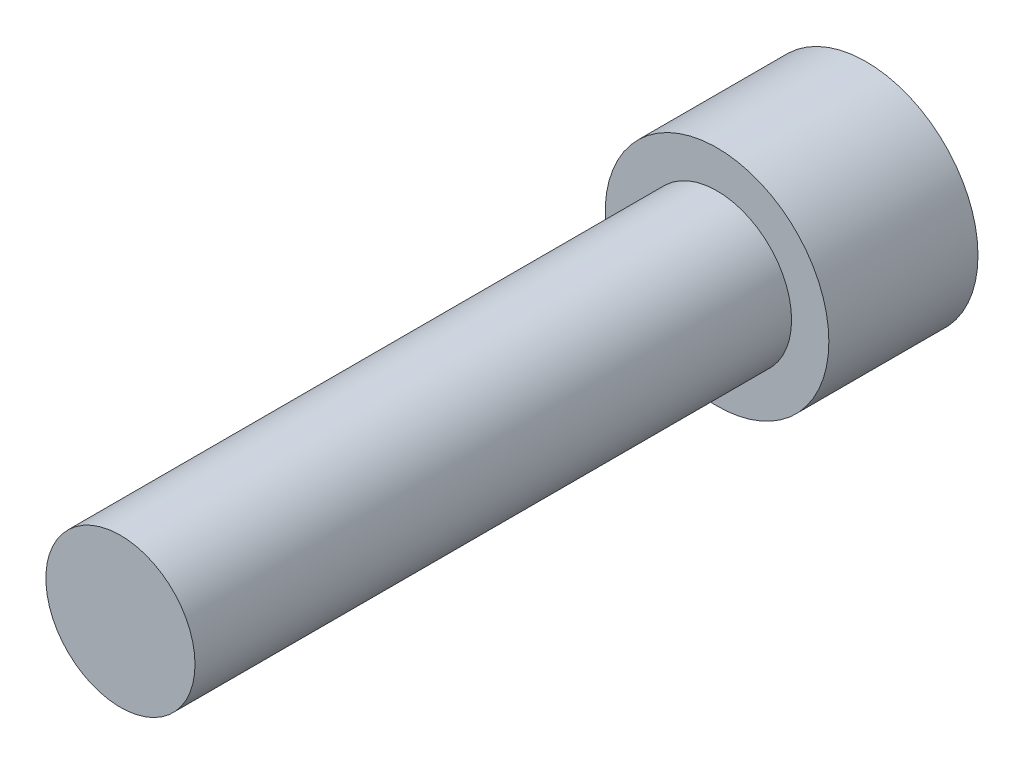
ISO-10303-21;
HEADER;
FILE_DESCRIPTION(('STEP AP214'),'2;1');
FILE_NAME('part.step','',(''),(''),'','','');
FILE_SCHEMA(('AUTOMOTIVE_DESIGN { 1 0 10303 214 1 1 1 1 }'));
ENDSEC;
DATA;
#1=APPLICATION_CONTEXT('core data for automotive mechanical design processes');
#2=APPLICATION_PROTOCOL_DEFINITION('international standard','automotive_design',2000,#1);
#3=PRODUCT_CONTEXT('',#1,'mechanical');
#4=PRODUCT('Part','Part','',(#3));
#5=PRODUCT_RELATED_PRODUCT_CATEGORY('part','',(#4));
#6=PRODUCT_DEFINITION_FORMATION('','',#4);
#7=PRODUCT_DEFINITION_CONTEXT('part definition',#1,'design');
#8=PRODUCT_DEFINITION('design','',#6,#7);
#9=PRODUCT_DEFINITION_SHAPE('','',#8);
#10=(LENGTH_UNIT() NAMED_UNIT(*) SI_UNIT(.MILLI.,.METRE.));
#11=(NAMED_UNIT(*) PLANE_ANGLE_UNIT() SI_UNIT($,.RADIAN.));
#12=(NAMED_UNIT(*) SI_UNIT($,.STERADIAN.) SOLID_ANGLE_UNIT());
#13=UNCERTAINTY_MEASURE_WITH_UNIT(LENGTH_MEASURE(1.E-05),#10,'distance_accuracy_value','');
#14=(GEOMETRIC_REPRESENTATION_CONTEXT(3) GLOBAL_UNCERTAINTY_ASSIGNED_CONTEXT((#13)) GLOBAL_UNIT_ASSIGNED_CONTEXT((#10,
#11,#12)) REPRESENTATION_CONTEXT('',''));
#15=CARTESIAN_POINT('',(0.,0.,0.));
#16=DIRECTION('',(0.,0.,1.));
#17=DIRECTION('',(1.,0.,0.));
#18=AXIS2_PLACEMENT_3D('',#15,#16,#17);
#19=CARTESIAN_POINT('',(0.,0.,10.));
#20=DIRECTION('',(0.,0.,-1.));
#21=DIRECTION('',(-1.,0.,0.));
#22=AXIS2_PLACEMENT_3D('',#19,#20,#21);
#23=CYLINDRICAL_SURFACE('',#22,7.5);
#24=CARTESIAN_POINT('',(0.,0.,10.));
#25=DIRECTION('',(0.,0.,1.));
#26=DIRECTION('',(1.,0.,0.));
#27=AXIS2_PLACEMENT_3D('',#24,#25,#26);
#28=CIRCLE('',#27,7.5);
#29=CARTESIAN_POINT('',(7.5,0.,10.));
#30=VERTEX_POINT('',#29);
#31=EDGE_CURVE('E54',#30,#30,#28,.T.);
#32=ORIENTED_EDGE('',*,*,#31,.F.);
#33=EDGE_LOOP('',(#32));
#34=FACE_BOUND('',#33,.T.);
#35=CARTESIAN_POINT('',(0.,0.,0.));
#36=DIRECTION('',(0.,0.,1.));
#37=DIRECTION('',(1.,0.,0.));
#38=AXIS2_PLACEMENT_3D('',#35,#36,#37);
#39=CIRCLE('',#38,7.5);
#40=CARTESIAN_POINT('',(7.5,0.,0.));
#41=VERTEX_POINT('',#40);
#42=EDGE_CURVE('E48',#41,#41,#39,.T.);
#43=ORIENTED_EDGE('',*,*,#42,.T.);
#44=EDGE_LOOP('',(#43));
#45=FACE_BOUND('',#44,.T.);
#46=ADVANCED_FACE('F45',(#34,#45),#23,.T.);
#47=CARTESIAN_POINT('',(0.,0.,10.));
#48=DIRECTION('',(0.,0.,1.));
#49=DIRECTION('',(1.,0.,0.));
#50=AXIS2_PLACEMENT_3D('',#47,#48,#49);
#51=PLANE('',#50);
#52=CARTESIAN_POINT('',(0.,0.,10.));
#53=DIRECTION('',(0.,0.,1.));
#54=DIRECTION('',(1.,0.,0.));
#55=AXIS2_PLACEMENT_3D('',#52,#53,#54);
#56=CIRCLE('',#55,5.);
#57=CARTESIAN_POINT('',(5.,0.,10.));
#58=VERTEX_POINT('',#57);
#59=EDGE_CURVE('E11',#58,#58,#56,.T.);
#60=ORIENTED_EDGE('',*,*,#59,.F.);
#61=EDGE_LOOP('',(#60));
#62=FACE_BOUND('',#61,.T.);
#63=ORIENTED_EDGE('',*,*,#31,.T.);
#64=EDGE_LOOP('',(#63));
#65=FACE_BOUND('',#64,.T.);
#66=ADVANCED_FACE('F185',(#62,#65),#51,.T.);
#67=CARTESIAN_POINT('',(0.,0.,0.));
#68=DIRECTION('',(0.,0.,1.));
#69=DIRECTION('',(1.,0.,0.));
#70=AXIS2_PLACEMENT_3D('',#67,#68,#69);
#71=PLANE('',#70);
#72=DIRECTION('',(1.,0.,0.));
#73=VECTOR('',#72,1.);
#74=CARTESIAN_POINT('',(-2.88675134594813,5.,0.));
#75=LINE('',#74,#73);
#76=CARTESIAN_POINT('',(-2.88675134594813,5.,0.));
#77=VERTEX_POINT('',#76);
#78=CARTESIAN_POINT('',(2.88675134594813,5.,0.));
#79=VERTEX_POINT('',#78);
#80=EDGE_CURVE('E142',#77,#79,#75,.T.);
#81=ORIENTED_EDGE('',*,*,#80,.F.);
#82=DIRECTION('',(0.5,0.866025403784439,0.));
#83=VECTOR('',#82,1.);
#84=CARTESIAN_POINT('',(-5.77350269189626,0.,0.));
#85=LINE('',#84,#83);
#86=CARTESIAN_POINT('',(-5.77350269189626,0.,0.));
#87=VERTEX_POINT('',#86);
#88=EDGE_CURVE('E62',#87,#77,#85,.T.);
#89=ORIENTED_EDGE('',*,*,#88,.F.);
#90=DIRECTION('',(-0.5,0.866025403784439,0.));
#91=VECTOR('',#90,1.);
#92=CARTESIAN_POINT('',(-2.88675134594813,-5.,0.));
#93=LINE('',#92,#91);
#94=CARTESIAN_POINT('',(-2.88675134594813,-5.,0.));
#95=VERTEX_POINT('',#94);
#96=EDGE_CURVE('E155',#95,#87,#93,.T.);
#97=ORIENTED_EDGE('',*,*,#96,.F.);
#98=DIRECTION('',(-1.,0.,0.));
#99=VECTOR('',#98,1.);
#100=CARTESIAN_POINT('',(2.88675134594813,-5.,0.));
#101=LINE('',#100,#99);
#102=CARTESIAN_POINT('',(2.88675134594813,-5.,0.));
#103=VERTEX_POINT('',#102);
#104=EDGE_CURVE('E152',#103,#95,#101,.T.);
#105=ORIENTED_EDGE('',*,*,#104,.F.);
#106=DIRECTION('',(-0.5,-0.866025403784439,0.));
#107=VECTOR('',#106,1.);
#108=CARTESIAN_POINT('',(5.77350269189626,0.,0.));
#109=LINE('',#108,#107);
#110=CARTESIAN_POINT('',(5.77350269189626,0.,0.));
#111=VERTEX_POINT('',#110);
#112=EDGE_CURVE('E110',#111,#103,#109,.T.);
#113=ORIENTED_EDGE('',*,*,#112,.F.);
#114=DIRECTION('',(0.5,-0.866025403784439,0.));
#115=VECTOR('',#114,1.);
#116=CARTESIAN_POINT('',(2.88675134594813,5.,0.));
#117=LINE('',#116,#115);
#118=EDGE_CURVE('E146',#79,#111,#117,.T.);
#119=ORIENTED_EDGE('',*,*,#118,.F.);
#120=EDGE_LOOP('',(#81,#89,#97,#105,#113,#119));
#121=FACE_BOUND('',#120,.T.);
#122=ORIENTED_EDGE('',*,*,#42,.F.);
#123=EDGE_LOOP('',(#122));
#124=FACE_BOUND('',#123,.T.);
#125=ADVANCED_FACE('F182',(#121,#124),#71,.F.);
#126=CARTESIAN_POINT('',(0.,0.,50.));
#127=DIRECTION('',(0.,0.,-1.));
#128=DIRECTION('',(-1.,0.,0.));
#129=AXIS2_PLACEMENT_3D('',#126,#127,#128);
#130=CYLINDRICAL_SURFACE('',#129,5.);
#131=CARTESIAN_POINT('',(0.,0.,50.));
#132=DIRECTION('',(0.,0.,1.));
#133=DIRECTION('',(1.,0.,0.));
#134=AXIS2_PLACEMENT_3D('',#131,#132,#133);
#135=CIRCLE('',#134,5.);
#136=CARTESIAN_POINT('',(5.,0.,50.));
#137=VERTEX_POINT('',#136);
#138=EDGE_CURVE('E161',#137,#137,#135,.T.);
#139=ORIENTED_EDGE('',*,*,#138,.F.);
#140=EDGE_LOOP('',(#139));
#141=FACE_BOUND('',#140,.T.);
#142=ORIENTED_EDGE('',*,*,#59,.T.);
#143=EDGE_LOOP('',(#142));
#144=FACE_BOUND('',#143,.T.);
#145=ADVANCED_FACE('F184',(#141,#144),#130,.T.);
#146=CARTESIAN_POINT('',(0.,0.,50.));
#147=DIRECTION('',(0.,0.,1.));
#148=DIRECTION('',(1.,0.,0.));
#149=AXIS2_PLACEMENT_3D('',#146,#147,#148);
#150=PLANE('',#149);
#151=ORIENTED_EDGE('',*,*,#138,.T.);
#152=EDGE_LOOP('',(#151));
#153=FACE_BOUND('',#152,.T.);
#154=ADVANCED_FACE('F192',(#153),#150,.T.);
#155=CARTESIAN_POINT('',(-5.77350269189626,0.,7.));
#156=DIRECTION('',(-0.866025403784438,0.5,0.));
#157=DIRECTION('',(-0.5,-0.866025403784439,0.));
#158=AXIS2_PLACEMENT_3D('',#155,#156,#157);
#159=PLANE('',#158);
#160=ORIENTED_EDGE('',*,*,#88,.T.);
#161=DIRECTION('',(0.,0.,-1.));
#162=VECTOR('',#161,1.);
#163=CARTESIAN_POINT('',(-2.88675134594813,5.,7.));
#164=LINE('',#163,#162);
#165=CARTESIAN_POINT('',(-2.88675134594813,5.,7.));
#166=VERTEX_POINT('',#165);
#167=EDGE_CURVE('E92',#166,#77,#164,.T.);
#168=ORIENTED_EDGE('',*,*,#167,.F.);
#169=DIRECTION('',(0.5,0.866025403784439,0.));
#170=VECTOR('',#169,1.);
#171=CARTESIAN_POINT('',(-5.77350269189626,0.,7.));
#172=LINE('',#171,#170);
#173=CARTESIAN_POINT('',(-5.77350269189626,0.,7.));
#174=VERTEX_POINT('',#173);
#175=EDGE_CURVE('E158',#174,#166,#172,.T.);
#176=ORIENTED_EDGE('',*,*,#175,.F.);
#177=DIRECTION('',(0.,0.,-1.));
#178=VECTOR('',#177,1.);
#179=CARTESIAN_POINT('',(-5.77350269189626,0.,7.));
#180=LINE('',#179,#178);
#181=EDGE_CURVE('E70',#174,#87,#180,.T.);
#182=ORIENTED_EDGE('',*,*,#181,.T.);
#183=EDGE_LOOP('',(#160,#168,#176,#182));
#184=FACE_BOUND('',#183,.T.);
#185=ADVANCED_FACE('F218',(#184),#159,.F.);
#186=CARTESIAN_POINT('',(-2.88675134594813,-5.,7.));
#187=DIRECTION('',(-0.866025403784439,-0.5,0.));
#188=DIRECTION('',(0.5,-0.866025403784439,0.));
#189=AXIS2_PLACEMENT_3D('',#186,#187,#188);
#190=PLANE('',#189);
#191=ORIENTED_EDGE('',*,*,#96,.T.);
#192=ORIENTED_EDGE('',*,*,#181,.F.);
#193=DIRECTION('',(-0.5,0.866025403784439,0.));
#194=VECTOR('',#193,1.);
#195=CARTESIAN_POINT('',(-2.88675134594813,-5.,7.));
#196=LINE('',#195,#194);
#197=CARTESIAN_POINT('',(-2.88675134594813,-5.,7.));
#198=VERTEX_POINT('',#197);
#199=EDGE_CURVE('E124',#198,#174,#196,.T.);
#200=ORIENTED_EDGE('',*,*,#199,.F.);
#201=DIRECTION('',(0.,0.,-1.));
#202=VECTOR('',#201,1.);
#203=CARTESIAN_POINT('',(-2.88675134594813,-5.,7.));
#204=LINE('',#203,#202);
#205=EDGE_CURVE('E115',#198,#95,#204,.T.);
#206=ORIENTED_EDGE('',*,*,#205,.T.);
#207=EDGE_LOOP('',(#191,#192,#200,#206));
#208=FACE_BOUND('',#207,.T.);
#209=ADVANCED_FACE('F230',(#208),#190,.F.);
#210=CARTESIAN_POINT('',(2.88675134594813,-5.,7.));
#211=DIRECTION('',(0.,-1.,0.));
#212=DIRECTION('',(0.,0.,-1.));
#213=AXIS2_PLACEMENT_3D('',#210,#211,#212);
#214=PLANE('',#213);
#215=ORIENTED_EDGE('',*,*,#104,.T.);
#216=ORIENTED_EDGE('',*,*,#205,.F.);
#217=DIRECTION('',(-1.,0.,0.));
#218=VECTOR('',#217,1.);
#219=CARTESIAN_POINT('',(2.88675134594813,-5.,7.));
#220=LINE('',#219,#218);
#221=CARTESIAN_POINT('',(2.88675134594813,-5.,7.));
#222=VERTEX_POINT('',#221);
#223=EDGE_CURVE('E119',#222,#198,#220,.T.);
#224=ORIENTED_EDGE('',*,*,#223,.F.);
#225=DIRECTION('',(0.,0.,-1.));
#226=VECTOR('',#225,1.);
#227=CARTESIAN_POINT('',(2.88675134594813,-5.,7.));
#228=LINE('',#227,#226);
#229=EDGE_CURVE('E103',#222,#103,#228,.T.);
#230=ORIENTED_EDGE('',*,*,#229,.T.);
#231=EDGE_LOOP('',(#215,#216,#224,#230));
#232=FACE_BOUND('',#231,.T.);
#233=ADVANCED_FACE('F120',(#232),#214,.F.);
#234=CARTESIAN_POINT('',(5.77350269189626,0.,7.));
#235=DIRECTION('',(0.866025403784439,-0.5,0.));
#236=DIRECTION('',(0.5,0.866025403784439,0.));
#237=AXIS2_PLACEMENT_3D('',#234,#235,#236);
#238=PLANE('',#237);
#239=ORIENTED_EDGE('',*,*,#112,.T.);
#240=ORIENTED_EDGE('',*,*,#229,.F.);
#241=DIRECTION('',(-0.5,-0.866025403784439,0.));
#242=VECTOR('',#241,1.);
#243=CARTESIAN_POINT('',(5.77350269189626,0.,7.));
#244=LINE('',#243,#242);
#245=CARTESIAN_POINT('',(5.77350269189626,0.,7.));
#246=VERTEX_POINT('',#245);
#247=EDGE_CURVE('E107',#246,#222,#244,.T.);
#248=ORIENTED_EDGE('',*,*,#247,.F.);
#249=DIRECTION('',(0.,0.,-1.));
#250=VECTOR('',#249,1.);
#251=CARTESIAN_POINT('',(5.77350269189626,0.,7.));
#252=LINE('',#251,#250);
#253=EDGE_CURVE('E116',#246,#111,#252,.T.);
#254=ORIENTED_EDGE('',*,*,#253,.T.);
#255=EDGE_LOOP('',(#239,#240,#248,#254));
#256=FACE_BOUND('',#255,.T.);
#257=ADVANCED_FACE('F105',(#256),#238,.F.);
#258=CARTESIAN_POINT('',(2.88675134594813,5.,7.));
#259=DIRECTION('',(0.866025403784439,0.5,0.));
#260=DIRECTION('',(-0.5,0.866025403784438,0.));
#261=AXIS2_PLACEMENT_3D('',#258,#259,#260);
#262=PLANE('',#261);
#263=ORIENTED_EDGE('',*,*,#118,.T.);
#264=ORIENTED_EDGE('',*,*,#253,.F.);
#265=DIRECTION('',(0.5,-0.866025403784439,0.));
#266=VECTOR('',#265,1.);
#267=CARTESIAN_POINT('',(2.88675134594813,5.,7.));
#268=LINE('',#267,#266);
#269=CARTESIAN_POINT('',(2.88675134594813,5.,7.));
#270=VERTEX_POINT('',#269);
#271=EDGE_CURVE('E130',#270,#246,#268,.T.);
#272=ORIENTED_EDGE('',*,*,#271,.F.);
#273=DIRECTION('',(0.,0.,-1.));
#274=VECTOR('',#273,1.);
#275=CARTESIAN_POINT('',(2.88675134594813,5.,7.));
#276=LINE('',#275,#274);
#277=EDGE_CURVE('E166',#270,#79,#276,.T.);
#278=ORIENTED_EDGE('',*,*,#277,.T.);
#279=EDGE_LOOP('',(#263,#264,#272,#278));
#280=FACE_BOUND('',#279,.T.);
#281=ADVANCED_FACE('F255',(#280),#262,.F.);
#282=CARTESIAN_POINT('',(-2.88675134594813,5.,7.));
#283=DIRECTION('',(0.,1.,0.));
#284=DIRECTION('',(0.,0.,1.));
#285=AXIS2_PLACEMENT_3D('',#282,#283,#284);
#286=PLANE('',#285);
#287=ORIENTED_EDGE('',*,*,#80,.T.);
#288=ORIENTED_EDGE('',*,*,#277,.F.);
#289=DIRECTION('',(1.,0.,0.));
#290=VECTOR('',#289,1.);
#291=CARTESIAN_POINT('',(-2.88675134594813,5.,7.));
#292=LINE('',#291,#290);
#293=EDGE_CURVE('E134',#166,#270,#292,.T.);
#294=ORIENTED_EDGE('',*,*,#293,.F.);
#295=ORIENTED_EDGE('',*,*,#167,.T.);
#296=EDGE_LOOP('',(#287,#288,#294,#295));
#297=FACE_BOUND('',#296,.T.);
#298=ADVANCED_FACE('F264',(#297),#286,.F.);
#299=CARTESIAN_POINT('',(0.,0.,7.));
#300=DIRECTION('',(0.,0.,-1.));
#301=DIRECTION('',(-1.,0.,0.));
#302=AXIS2_PLACEMENT_3D('',#299,#300,#301);
#303=PLANE('',#302);
#304=ORIENTED_EDGE('',*,*,#175,.T.);
#305=ORIENTED_EDGE('',*,*,#293,.T.);
#306=ORIENTED_EDGE('',*,*,#271,.T.);
#307=ORIENTED_EDGE('',*,*,#247,.T.);
#308=ORIENTED_EDGE('',*,*,#223,.T.);
#309=ORIENTED_EDGE('',*,*,#199,.T.);
#310=EDGE_LOOP('',(#304,#305,#306,#307,#308,#309));
#311=FACE_BOUND('',#310,.T.);
#312=ADVANCED_FACE('F127',(#311),#303,.T.);
#313=CLOSED_SHELL('',(#46,#66,#125,#145,#154,#185,#209,#233,#257,#281,#298,#312));
#314=MANIFOLD_SOLID_BREP('B2',#313);
#315=ADVANCED_BREP_SHAPE_REPRESENTATION('',(#18,#314),#14);
#316=SHAPE_DEFINITION_REPRESENTATION(#9,#315);
ENDSEC;
END-ISO-10303-21;
